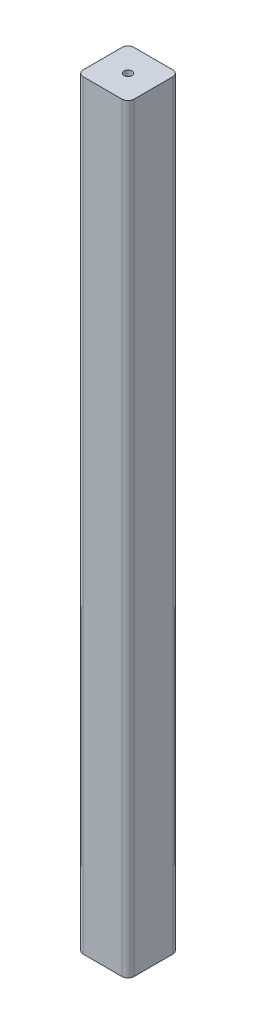
ISO-10303-21;
HEADER;
FILE_DESCRIPTION(('STEP AP214'),'2;1');
FILE_NAME('part.step','',(''),(''),'','','');
FILE_SCHEMA(('AUTOMOTIVE_DESIGN { 1 0 10303 214 1 1 1 1 }'));
ENDSEC;
DATA;
#1=APPLICATION_CONTEXT('core data for automotive mechanical design processes');
#2=APPLICATION_PROTOCOL_DEFINITION('international standard','automotive_design',2000,#1);
#3=PRODUCT_CONTEXT('',#1,'mechanical');
#4=PRODUCT('Part','Part','',(#3));
#5=PRODUCT_RELATED_PRODUCT_CATEGORY('part','',(#4));
#6=PRODUCT_DEFINITION_FORMATION('','',#4);
#7=PRODUCT_DEFINITION_CONTEXT('part definition',#1,'design');
#8=PRODUCT_DEFINITION('design','',#6,#7);
#9=PRODUCT_DEFINITION_SHAPE('','',#8);
#10=(LENGTH_UNIT() NAMED_UNIT(*) SI_UNIT(.MILLI.,.METRE.));
#11=(NAMED_UNIT(*) PLANE_ANGLE_UNIT() SI_UNIT($,.RADIAN.));
#12=(NAMED_UNIT(*) SI_UNIT($,.STERADIAN.) SOLID_ANGLE_UNIT());
#13=UNCERTAINTY_MEASURE_WITH_UNIT(LENGTH_MEASURE(1.E-05),#10,'distance_accuracy_value','');
#14=(GEOMETRIC_REPRESENTATION_CONTEXT(3) GLOBAL_UNCERTAINTY_ASSIGNED_CONTEXT((#13)) GLOBAL_UNIT_ASSIGNED_CONTEXT((#10,
#11,#12)) REPRESENTATION_CONTEXT('',''));
#15=CARTESIAN_POINT('',(0.,0.,0.));
#16=DIRECTION('',(0.,0.,1.));
#17=DIRECTION('',(1.,0.,0.));
#18=AXIS2_PLACEMENT_3D('',#15,#16,#17);
#19=CARTESIAN_POINT('',(22.4,380.,-22.4));
#20=DIRECTION('',(0.,1.,0.));
#21=DIRECTION('',(0.,0.,1.));
#22=AXIS2_PLACEMENT_3D('',#19,#20,#21);
#23=PLANE('',#22);
#24=CARTESIAN_POINT('',(22.4,380.,-22.4));
#25=DIRECTION('',(0.,1.,0.));
#26=DIRECTION('',(0.,0.,1.));
#27=AXIS2_PLACEMENT_3D('',#24,#25,#26);
#28=CIRCLE('',#27,3.);
#29=CARTESIAN_POINT('',(25.4,380.,-22.4));
#30=VERTEX_POINT('',#29);
#31=CARTESIAN_POINT('',(22.4,380.,-25.4));
#32=VERTEX_POINT('',#31);
#33=EDGE_CURVE('E164',#30,#32,#28,.T.);
#34=ORIENTED_EDGE('',*,*,#33,.T.);
#35=DIRECTION('',(-1.,0.,0.));
#36=VECTOR('',#35,1.);
#37=CARTESIAN_POINT('',(3.00000000000002,380.,-25.4));
#38=LINE('',#37,#36);
#39=CARTESIAN_POINT('',(3.,380.,-25.4));
#40=VERTEX_POINT('',#39);
#41=EDGE_CURVE('E100',#32,#40,#38,.T.);
#42=ORIENTED_EDGE('',*,*,#41,.T.);
#43=CARTESIAN_POINT('',(3.,380.,-22.4));
#44=DIRECTION('',(0.,1.,0.));
#45=DIRECTION('',(0.,0.,-1.));
#46=AXIS2_PLACEMENT_3D('',#43,#44,#45);
#47=CIRCLE('',#46,3.);
#48=CARTESIAN_POINT('',(0.,380.,-22.4));
#49=VERTEX_POINT('',#48);
#50=EDGE_CURVE('E185',#40,#49,#47,.T.);
#51=ORIENTED_EDGE('',*,*,#50,.T.);
#52=DIRECTION('',(0.,0.,1.));
#53=VECTOR('',#52,1.);
#54=CARTESIAN_POINT('',(0.,380.,-3.00000000000002));
#55=LINE('',#54,#53);
#56=CARTESIAN_POINT('',(0.,380.,-3.00000000000002));
#57=VERTEX_POINT('',#56);
#58=EDGE_CURVE('E199',#49,#57,#55,.T.);
#59=ORIENTED_EDGE('',*,*,#58,.T.);
#60=CARTESIAN_POINT('',(3.,380.,-3.));
#61=DIRECTION('',(0.,1.,0.));
#62=DIRECTION('',(0.,0.,1.));
#63=AXIS2_PLACEMENT_3D('',#60,#61,#62);
#64=CIRCLE('',#63,3.);
#65=CARTESIAN_POINT('',(3.00000000000002,380.,0.));
#66=VERTEX_POINT('',#65);
#67=EDGE_CURVE('E119',#57,#66,#64,.T.);
#68=ORIENTED_EDGE('',*,*,#67,.T.);
#69=DIRECTION('',(1.,0.,0.));
#70=VECTOR('',#69,1.);
#71=CARTESIAN_POINT('',(3.00000000000002,380.,0.));
#72=LINE('',#71,#70);
#73=CARTESIAN_POINT('',(22.4,380.,0.));
#74=VERTEX_POINT('',#73);
#75=EDGE_CURVE('E113',#66,#74,#72,.T.);
#76=ORIENTED_EDGE('',*,*,#75,.T.);
#77=CARTESIAN_POINT('',(22.4,380.,-3.));
#78=DIRECTION('',(0.,1.,0.));
#79=DIRECTION('',(0.,0.,1.));
#80=AXIS2_PLACEMENT_3D('',#77,#78,#79);
#81=CIRCLE('',#80,3.);
#82=CARTESIAN_POINT('',(25.4,380.,-3.00000000000002));
#83=VERTEX_POINT('',#82);
#84=EDGE_CURVE('E117',#74,#83,#81,.T.);
#85=ORIENTED_EDGE('',*,*,#84,.T.);
#86=DIRECTION('',(0.,0.,-1.));
#87=VECTOR('',#86,1.);
#88=CARTESIAN_POINT('',(25.4,380.,-3.00000000000002));
#89=LINE('',#88,#87);
#90=EDGE_CURVE('E57',#83,#30,#89,.T.);
#91=ORIENTED_EDGE('',*,*,#90,.T.);
#92=EDGE_LOOP('',(#34,#42,#51,#59,#68,#76,#85,#91));
#93=FACE_BOUND('',#92,.T.);
#94=CARTESIAN_POINT('',(12.7,380.,-12.7));
#95=DIRECTION('',(0.,1.,0.));
#96=DIRECTION('',(0.,0.,1.));
#97=AXIS2_PLACEMENT_3D('',#94,#95,#96);
#98=CIRCLE('',#97,2.);
#99=CARTESIAN_POINT('',(12.7,380.,-10.7));
#100=VERTEX_POINT('',#99);
#101=EDGE_CURVE('E146',#100,#100,#98,.T.);
#102=ORIENTED_EDGE('',*,*,#101,.F.);
#103=EDGE_LOOP('',(#102));
#104=FACE_BOUND('',#103,.T.);
#105=ADVANCED_FACE('F39',(#93,#104),#23,.T.);
#106=CARTESIAN_POINT('',(22.4,0.,-22.4));
#107=DIRECTION('',(0.,1.,0.));
#108=DIRECTION('',(0.,0.,1.));
#109=AXIS2_PLACEMENT_3D('',#106,#107,#108);
#110=PLANE('',#109);
#111=CARTESIAN_POINT('',(22.4,0.,-22.4));
#112=DIRECTION('',(0.,1.,0.));
#113=DIRECTION('',(0.,0.,1.));
#114=AXIS2_PLACEMENT_3D('',#111,#112,#113);
#115=CIRCLE('',#114,3.);
#116=CARTESIAN_POINT('',(25.4,0.,-22.4));
#117=VERTEX_POINT('',#116);
#118=CARTESIAN_POINT('',(22.4,0.,-25.4));
#119=VERTEX_POINT('',#118);
#120=EDGE_CURVE('E141',#117,#119,#115,.T.);
#121=ORIENTED_EDGE('',*,*,#120,.F.);
#122=DIRECTION('',(0.,0.,-1.));
#123=VECTOR('',#122,1.);
#124=CARTESIAN_POINT('',(25.4,0.,-3.00000000000002));
#125=LINE('',#124,#123);
#126=CARTESIAN_POINT('',(25.4,0.,-3.00000000000002));
#127=VERTEX_POINT('',#126);
#128=EDGE_CURVE('E92',#127,#117,#125,.T.);
#129=ORIENTED_EDGE('',*,*,#128,.F.);
#130=CARTESIAN_POINT('',(22.4,0.,-3.));
#131=DIRECTION('',(0.,1.,0.));
#132=DIRECTION('',(0.,0.,1.));
#133=AXIS2_PLACEMENT_3D('',#130,#131,#132);
#134=CIRCLE('',#133,3.);
#135=CARTESIAN_POINT('',(22.4,0.,0.));
#136=VERTEX_POINT('',#135);
#137=EDGE_CURVE('E86',#136,#127,#134,.T.);
#138=ORIENTED_EDGE('',*,*,#137,.F.);
#139=DIRECTION('',(1.,0.,0.));
#140=VECTOR('',#139,1.);
#141=CARTESIAN_POINT('',(3.00000000000002,0.,0.));
#142=LINE('',#141,#140);
#143=CARTESIAN_POINT('',(3.00000000000002,0.,0.));
#144=VERTEX_POINT('',#143);
#145=EDGE_CURVE('E128',#144,#136,#142,.T.);
#146=ORIENTED_EDGE('',*,*,#145,.F.);
#147=CARTESIAN_POINT('',(3.,0.,-3.));
#148=DIRECTION('',(0.,1.,0.));
#149=DIRECTION('',(0.,0.,1.));
#150=AXIS2_PLACEMENT_3D('',#147,#148,#149);
#151=CIRCLE('',#150,3.);
#152=CARTESIAN_POINT('',(0.,0.,-3.00000000000002));
#153=VERTEX_POINT('',#152);
#154=EDGE_CURVE('E155',#153,#144,#151,.T.);
#155=ORIENTED_EDGE('',*,*,#154,.F.);
#156=DIRECTION('',(0.,0.,1.));
#157=VECTOR('',#156,1.);
#158=CARTESIAN_POINT('',(0.,0.,-3.00000000000002));
#159=LINE('',#158,#157);
#160=CARTESIAN_POINT('',(0.,0.,-22.4));
#161=VERTEX_POINT('',#160);
#162=EDGE_CURVE('E152',#161,#153,#159,.T.);
#163=ORIENTED_EDGE('',*,*,#162,.F.);
#164=CARTESIAN_POINT('',(3.,0.,-22.4));
#165=DIRECTION('',(0.,1.,0.));
#166=DIRECTION('',(0.,0.,-1.));
#167=AXIS2_PLACEMENT_3D('',#164,#165,#166);
#168=CIRCLE('',#167,3.);
#169=CARTESIAN_POINT('',(3.,0.,-25.4));
#170=VERTEX_POINT('',#169);
#171=EDGE_CURVE('E149',#170,#161,#168,.T.);
#172=ORIENTED_EDGE('',*,*,#171,.F.);
#173=DIRECTION('',(-1.,0.,0.));
#174=VECTOR('',#173,1.);
#175=CARTESIAN_POINT('',(3.00000000000002,0.,-25.4));
#176=LINE('',#175,#174);
#177=EDGE_CURVE('E145',#119,#170,#176,.T.);
#178=ORIENTED_EDGE('',*,*,#177,.F.);
#179=EDGE_LOOP('',(#121,#129,#138,#146,#155,#163,#172,#178));
#180=FACE_BOUND('',#179,.T.);
#181=CARTESIAN_POINT('',(12.7,0.,-12.7));
#182=DIRECTION('',(0.,1.,0.));
#183=DIRECTION('',(0.,0.,1.));
#184=AXIS2_PLACEMENT_3D('',#181,#182,#183);
#185=CIRCLE('',#184,2.);
#186=CARTESIAN_POINT('',(12.7,0.,-10.7));
#187=VERTEX_POINT('',#186);
#188=EDGE_CURVE('E209',#187,#187,#185,.T.);
#189=ORIENTED_EDGE('',*,*,#188,.T.);
#190=EDGE_LOOP('',(#189));
#191=FACE_BOUND('',#190,.T.);
#192=ADVANCED_FACE('F189',(#180,#191),#110,.F.);
#193=CARTESIAN_POINT('',(22.4,380.,-22.4));
#194=DIRECTION('',(0.,-1.,0.));
#195=DIRECTION('',(0.,0.,-1.));
#196=AXIS2_PLACEMENT_3D('',#193,#194,#195);
#197=CYLINDRICAL_SURFACE('',#196,3.);
#198=ORIENTED_EDGE('',*,*,#120,.T.);
#199=DIRECTION('',(0.,-1.,0.));
#200=VECTOR('',#199,1.);
#201=CARTESIAN_POINT('',(22.4,380.,-25.4));
#202=LINE('',#201,#200);
#203=EDGE_CURVE('E11',#32,#119,#202,.T.);
#204=ORIENTED_EDGE('',*,*,#203,.F.);
#205=ORIENTED_EDGE('',*,*,#33,.F.);
#206=DIRECTION('',(0.,-1.,0.));
#207=VECTOR('',#206,1.);
#208=CARTESIAN_POINT('',(25.4,380.,-22.4));
#209=LINE('',#208,#207);
#210=EDGE_CURVE('E137',#30,#117,#209,.T.);
#211=ORIENTED_EDGE('',*,*,#210,.T.);
#212=EDGE_LOOP('',(#198,#204,#205,#211));
#213=FACE_BOUND('',#212,.T.);
#214=ADVANCED_FACE('F41',(#213),#197,.T.);
#215=CARTESIAN_POINT('',(3.00000000000002,380.,-25.4));
#216=DIRECTION('',(0.,0.,1.));
#217=DIRECTION('',(1.,0.,0.));
#218=AXIS2_PLACEMENT_3D('',#215,#216,#217);
#219=PLANE('',#218);
#220=ORIENTED_EDGE('',*,*,#177,.T.);
#221=DIRECTION('',(0.,-1.,0.));
#222=VECTOR('',#221,1.);
#223=CARTESIAN_POINT('',(3.,380.,-25.4));
#224=LINE('',#223,#222);
#225=EDGE_CURVE('E49',#40,#170,#224,.T.);
#226=ORIENTED_EDGE('',*,*,#225,.F.);
#227=ORIENTED_EDGE('',*,*,#41,.F.);
#228=ORIENTED_EDGE('',*,*,#203,.T.);
#229=EDGE_LOOP('',(#220,#226,#227,#228));
#230=FACE_BOUND('',#229,.T.);
#231=ADVANCED_FACE('F239',(#230),#219,.F.);
#232=CARTESIAN_POINT('',(3.,380.,-22.4));
#233=DIRECTION('',(0.,-1.,0.));
#234=DIRECTION('',(0.,0.,-1.));
#235=AXIS2_PLACEMENT_3D('',#232,#233,#234);
#236=CYLINDRICAL_SURFACE('',#235,3.);
#237=ORIENTED_EDGE('',*,*,#171,.T.);
#238=DIRECTION('',(0.,-1.,0.));
#239=VECTOR('',#238,1.);
#240=CARTESIAN_POINT('',(0.,380.,-22.4));
#241=LINE('',#240,#239);
#242=EDGE_CURVE('E175',#49,#161,#241,.T.);
#243=ORIENTED_EDGE('',*,*,#242,.F.);
#244=ORIENTED_EDGE('',*,*,#50,.F.);
#245=ORIENTED_EDGE('',*,*,#225,.T.);
#246=EDGE_LOOP('',(#237,#243,#244,#245));
#247=FACE_BOUND('',#246,.T.);
#248=ADVANCED_FACE('F183',(#247),#236,.T.);
#249=CARTESIAN_POINT('',(0.,380.,-3.00000000000002));
#250=DIRECTION('',(1.,0.,0.));
#251=DIRECTION('',(0.,0.,-1.));
#252=AXIS2_PLACEMENT_3D('',#249,#250,#251);
#253=PLANE('',#252);
#254=ORIENTED_EDGE('',*,*,#162,.T.);
#255=DIRECTION('',(0.,-1.,0.));
#256=VECTOR('',#255,1.);
#257=CARTESIAN_POINT('',(0.,380.,-3.00000000000002));
#258=LINE('',#257,#256);
#259=EDGE_CURVE('E171',#57,#153,#258,.T.);
#260=ORIENTED_EDGE('',*,*,#259,.F.);
#261=ORIENTED_EDGE('',*,*,#58,.F.);
#262=ORIENTED_EDGE('',*,*,#242,.T.);
#263=EDGE_LOOP('',(#254,#260,#261,#262));
#264=FACE_BOUND('',#263,.T.);
#265=ADVANCED_FACE('F194',(#264),#253,.F.);
#266=CARTESIAN_POINT('',(3.,380.,-3.));
#267=DIRECTION('',(0.,-1.,0.));
#268=DIRECTION('',(0.,0.,-1.));
#269=AXIS2_PLACEMENT_3D('',#266,#267,#268);
#270=CYLINDRICAL_SURFACE('',#269,3.);
#271=ORIENTED_EDGE('',*,*,#154,.T.);
#272=DIRECTION('',(0.,-1.,0.));
#273=VECTOR('',#272,1.);
#274=CARTESIAN_POINT('',(3.00000000000002,380.,0.));
#275=LINE('',#274,#273);
#276=EDGE_CURVE('E130',#66,#144,#275,.T.);
#277=ORIENTED_EDGE('',*,*,#276,.F.);
#278=ORIENTED_EDGE('',*,*,#67,.F.);
#279=ORIENTED_EDGE('',*,*,#259,.T.);
#280=EDGE_LOOP('',(#271,#277,#278,#279));
#281=FACE_BOUND('',#280,.T.);
#282=ADVANCED_FACE('F197',(#281),#270,.T.);
#283=CARTESIAN_POINT('',(3.00000000000002,380.,0.));
#284=DIRECTION('',(0.,0.,-1.));
#285=DIRECTION('',(-1.,0.,0.));
#286=AXIS2_PLACEMENT_3D('',#283,#284,#285);
#287=PLANE('',#286);
#288=ORIENTED_EDGE('',*,*,#145,.T.);
#289=DIRECTION('',(0.,-1.,0.));
#290=VECTOR('',#289,1.);
#291=CARTESIAN_POINT('',(22.4,380.,0.));
#292=LINE('',#291,#290);
#293=EDGE_CURVE('E125',#74,#136,#292,.T.);
#294=ORIENTED_EDGE('',*,*,#293,.F.);
#295=ORIENTED_EDGE('',*,*,#75,.F.);
#296=ORIENTED_EDGE('',*,*,#276,.T.);
#297=EDGE_LOOP('',(#288,#294,#295,#296));
#298=FACE_BOUND('',#297,.T.);
#299=ADVANCED_FACE('F126',(#298),#287,.F.);
#300=CARTESIAN_POINT('',(22.4,380.,-3.));
#301=DIRECTION('',(0.,-1.,0.));
#302=DIRECTION('',(0.,0.,-1.));
#303=AXIS2_PLACEMENT_3D('',#300,#301,#302);
#304=CYLINDRICAL_SURFACE('',#303,3.);
#305=ORIENTED_EDGE('',*,*,#137,.T.);
#306=DIRECTION('',(0.,-1.,0.));
#307=VECTOR('',#306,1.);
#308=CARTESIAN_POINT('',(25.4,380.,-3.00000000000002));
#309=LINE('',#308,#307);
#310=EDGE_CURVE('E131',#83,#127,#309,.T.);
#311=ORIENTED_EDGE('',*,*,#310,.F.);
#312=ORIENTED_EDGE('',*,*,#84,.F.);
#313=ORIENTED_EDGE('',*,*,#293,.T.);
#314=EDGE_LOOP('',(#305,#311,#312,#313));
#315=FACE_BOUND('',#314,.T.);
#316=ADVANCED_FACE('F133',(#315),#304,.T.);
#317=CARTESIAN_POINT('',(25.4,380.,-3.00000000000002));
#318=DIRECTION('',(-1.,0.,0.));
#319=DIRECTION('',(0.,0.,1.));
#320=AXIS2_PLACEMENT_3D('',#317,#318,#319);
#321=PLANE('',#320);
#322=ORIENTED_EDGE('',*,*,#128,.T.);
#323=ORIENTED_EDGE('',*,*,#210,.F.);
#324=ORIENTED_EDGE('',*,*,#90,.F.);
#325=ORIENTED_EDGE('',*,*,#310,.T.);
#326=EDGE_LOOP('',(#322,#323,#324,#325));
#327=FACE_BOUND('',#326,.T.);
#328=ADVANCED_FACE('F227',(#327),#321,.F.);
#329=CARTESIAN_POINT('',(12.7,380.,-12.7));
#330=DIRECTION('',(0.,-1.,0.));
#331=DIRECTION('',(0.,0.,-1.));
#332=AXIS2_PLACEMENT_3D('',#329,#330,#331);
#333=CYLINDRICAL_SURFACE('',#332,2.);
#334=ORIENTED_EDGE('',*,*,#101,.T.);
#335=EDGE_LOOP('',(#334));
#336=FACE_BOUND('',#335,.T.);
#337=ORIENTED_EDGE('',*,*,#188,.F.);
#338=EDGE_LOOP('',(#337));
#339=FACE_BOUND('',#338,.T.);
#340=ADVANCED_FACE('F217',(#336,#339),#333,.F.);
#341=CLOSED_SHELL('',(#105,#192,#214,#231,#248,#265,#282,#299,#316,#328,#340));
#342=MANIFOLD_SOLID_BREP('B2',#341);
#343=ADVANCED_BREP_SHAPE_REPRESENTATION('',(#18,#342),#14);
#344=SHAPE_DEFINITION_REPRESENTATION(#9,#343);
ENDSEC;
END-ISO-10303-21;
